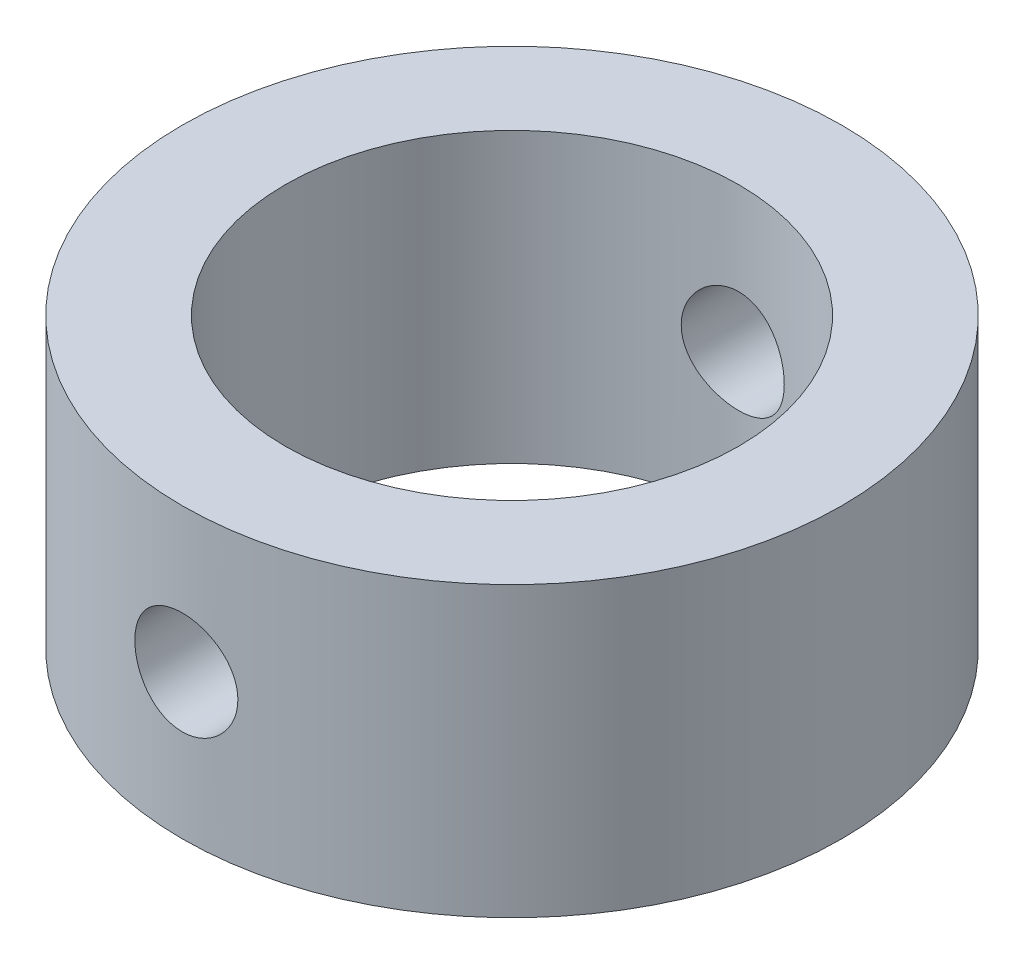
ISO-10303-21;
HEADER;
FILE_DESCRIPTION(('STEP AP214'),'2;1');
FILE_NAME('part.step','',(''),(''),'','','');
FILE_SCHEMA(('AUTOMOTIVE_DESIGN { 1 0 10303 214 1 1 1 1 }'));
ENDSEC;
DATA;
#1=APPLICATION_CONTEXT('core data for automotive mechanical design processes');
#2=APPLICATION_PROTOCOL_DEFINITION('international standard','automotive_design',2000,#1);
#3=PRODUCT_CONTEXT('',#1,'mechanical');
#4=PRODUCT('Part','Part','',(#3));
#5=PRODUCT_RELATED_PRODUCT_CATEGORY('part','',(#4));
#6=PRODUCT_DEFINITION_FORMATION('','',#4);
#7=PRODUCT_DEFINITION_CONTEXT('part definition',#1,'design');
#8=PRODUCT_DEFINITION('design','',#6,#7);
#9=PRODUCT_DEFINITION_SHAPE('','',#8);
#10=(LENGTH_UNIT() NAMED_UNIT(*) SI_UNIT(.MILLI.,.METRE.));
#11=(NAMED_UNIT(*) PLANE_ANGLE_UNIT() SI_UNIT($,.RADIAN.));
#12=(NAMED_UNIT(*) SI_UNIT($,.STERADIAN.) SOLID_ANGLE_UNIT());
#13=UNCERTAINTY_MEASURE_WITH_UNIT(LENGTH_MEASURE(1.E-05),#10,'distance_accuracy_value','');
#14=(GEOMETRIC_REPRESENTATION_CONTEXT(3) GLOBAL_UNCERTAINTY_ASSIGNED_CONTEXT((#13)) GLOBAL_UNIT_ASSIGNED_CONTEXT((#10,
#11,#12)) REPRESENTATION_CONTEXT('',''));
#15=CARTESIAN_POINT('',(0.,0.,0.));
#16=DIRECTION('',(0.,0.,1.));
#17=DIRECTION('',(1.,0.,0.));
#18=AXIS2_PLACEMENT_3D('',#15,#16,#17);
#19=CARTESIAN_POINT('',(0.,0.,0.));
#20=DIRECTION('',(0.,-1.,0.));
#21=DIRECTION('',(0.,0.,-1.));
#22=AXIS2_PLACEMENT_3D('',#19,#20,#21);
#23=CYLINDRICAL_SURFACE('',#22,16.);
#24=CARTESIAN_POINT('',(0.,9.5,-16.));
#25=CARTESIAN_POINT('',(-0.139515097271033,9.49999430172848,-15.9999977019448));
#26=CARTESIAN_POINT('',(-0.279109404865704,9.48828188622644,-15.9981561248574));
#27=CARTESIAN_POINT('',(-0.554391314978102,9.44175630872325,-15.9909869809759));
#28=CARTESIAN_POINT('',(-0.690075061323317,9.40692110749649,-15.9856560884472));
#29=CARTESIAN_POINT('',(-0.953512538047404,9.31522033719338,-15.9721069716578));
#30=CARTESIAN_POINT('',(-1.0812723522899,9.2583719186384,-15.9638909956317));
#31=CARTESIAN_POINT('',(-1.3254212510446,9.12430145485839,-15.9454779403815));
#32=CARTESIAN_POINT('',(-1.44181181036831,9.04708205696406,-15.9352811186255));
#33=CARTESIAN_POINT('',(-1.66091991165162,8.87376695164604,-15.9139426841436));
#34=CARTESIAN_POINT('',(-1.76352747914264,8.77753300510975,-15.9027945139234));
#35=CARTESIAN_POINT('',(-1.95120768822823,8.56921805173111,-15.8808607613029));
#36=CARTESIAN_POINT('',(-2.03627928654192,8.4571361026998,-15.8700752005075));
#37=CARTESIAN_POINT('',(-2.18690544328884,8.21956172865627,-15.8500242812745));
#38=CARTESIAN_POINT('',(-2.25235273557992,8.09400051763821,-15.840767397861));
#39=CARTESIAN_POINT('',(-2.36118681597065,7.8334985891422,-15.8249120174236));
#40=CARTESIAN_POINT('',(-2.40457491010063,7.69855842748944,-15.8183133630222));
#41=CARTESIAN_POINT('',(-2.46771559322167,7.42428909885621,-15.8085863451104));
#42=CARTESIAN_POINT('',(-2.48765705487496,7.2850044141812,-15.8054302653236));
#43=CARTESIAN_POINT('',(-2.50392369757622,7.00503281110736,-15.8028617107177));
#44=CARTESIAN_POINT('',(-2.50025034860466,6.86434598053396,-15.8034490028802));
#45=CARTESIAN_POINT('',(-2.4695458080889,6.58690296814731,-15.8082755045521));
#46=CARTESIAN_POINT('',(-2.44272562959693,6.45012277664685,-15.8124817218495));
#47=CARTESIAN_POINT('',(-2.36681937833752,6.18302799364068,-15.8240205634547));
#48=CARTESIAN_POINT('',(-2.31773262684132,6.05271359935946,-15.8313532830641));
#49=CARTESIAN_POINT('',(-2.19846916949384,5.80161128732284,-15.8483550685462));
#50=CARTESIAN_POINT('',(-2.12820372315549,5.68086620822693,-15.8580339308724));
#51=CARTESIAN_POINT('',(-1.96864058146637,5.45280046431446,-15.878630461501));
#52=CARTESIAN_POINT('',(-1.87934153253017,5.34548075511253,-15.8895482178821));
#53=CARTESIAN_POINT('',(-1.68309088822333,5.14608975336669,-15.911537862489));
#54=CARTESIAN_POINT('',(-1.57595800560539,5.05419684173054,-15.9226101363559));
#55=CARTESIAN_POINT('',(-1.34769694737936,4.8896668543601,-15.9435512534783));
#56=CARTESIAN_POINT('',(-1.22656870068132,4.81702987644317,-15.9534200906202));
#57=CARTESIAN_POINT('',(-0.973595927056492,4.69306192657761,-15.9708539902704));
#58=CARTESIAN_POINT('',(-0.841744186240461,4.641745441467,-15.9784174854193));
#59=CARTESIAN_POINT('',(-0.57114953469676,4.56203403255277,-15.9903756000068));
#60=CARTESIAN_POINT('',(-0.432407130687201,4.53363742593352,-15.9947704520898));
#61=CARTESIAN_POINT('',(-0.153508336763735,4.50081072354981,-15.9998651172728));
#62=CARTESIAN_POINT('',(-0.0133814615087023,4.49613552102382,-16.0006027179286));
#63=CARTESIAN_POINT('',(0.265654546411642,4.51023270533598,-15.9984028649127));
#64=CARTESIAN_POINT('',(0.404563719925156,4.52900430258911,-15.9954655349964));
#65=CARTESIAN_POINT('',(0.676473446265705,4.58925838768018,-15.9862692369322));
#66=CARTESIAN_POINT('',(0.809501262056042,4.63062075826773,-15.9800278421539));
#67=CARTESIAN_POINT('',(1.06673406785663,4.73475509439879,-15.9649207568356));
#68=CARTESIAN_POINT('',(1.19093861303941,4.79752813844267,-15.9560549341007));
#69=CARTESIAN_POINT('',(1.42807220225041,4.94327199112658,-15.9365897274094));
#70=CARTESIAN_POINT('',(1.54090512378373,5.02639742009048,-15.9259772866342));
#71=CARTESIAN_POINT('',(1.75110696507806,5.21027208590779,-15.9042388046444));
#72=CARTESIAN_POINT('',(1.84847490447018,5.31102243920485,-15.8931127309268));
#73=CARTESIAN_POINT('',(2.02588080776691,5.52838119721721,-15.8714802753665));
#74=CARTESIAN_POINT('',(2.10575398584126,5.64512484712233,-15.860980411908));
#75=CARTESIAN_POINT('',(2.2447556772664,5.89051607366133,-15.8419069280583));
#76=CARTESIAN_POINT('',(2.30388478778105,6.01916330748948,-15.83333325222));
#77=CARTESIAN_POINT('',(2.39946771944995,6.28422964071419,-15.8191307135236));
#78=CARTESIAN_POINT('',(2.43600654947912,6.42061746876562,-15.8134908234896));
#79=CARTESIAN_POINT('',(2.48564122040535,6.69768914366398,-15.8057657028079));
#80=CARTESIAN_POINT('',(2.49873883084997,6.83837266541901,-15.8036802038444));
#81=CARTESIAN_POINT('',(2.50107452690756,7.11839871590748,-15.8033105804488));
#82=CARTESIAN_POINT('',(2.49057180548425,7.2577390969335,-15.804985160429));
#83=CARTESIAN_POINT('',(2.44656223255901,7.53264529714429,-15.8118569894183));
#84=CARTESIAN_POINT('',(2.41305543086961,7.66821112450172,-15.8170542307995));
#85=CARTESIAN_POINT('',(2.32408329891852,7.93163782664052,-15.8303708885491));
#86=CARTESIAN_POINT('',(2.26863761738581,8.05950547825841,-15.8384876895341));
#87=CARTESIAN_POINT('',(2.13738768546417,8.30416561367627,-15.856731840474));
#88=CARTESIAN_POINT('',(2.06158262820886,8.42095765828843,-15.8668592701083));
#89=CARTESIAN_POINT('',(1.8908300813908,8.64146554412683,-15.8881156809226));
#90=CARTESIAN_POINT('',(1.79569107094768,8.74503219661384,-15.8992540116029));
#91=CARTESIAN_POINT('',(1.58937594638204,8.93482123638674,-15.9212004364073));
#92=CARTESIAN_POINT('',(1.47819612078432,9.02103959859188,-15.9320084534012));
#93=CARTESIAN_POINT('',(1.24216685884341,9.17415122303156,-15.952151024567));
#94=CARTESIAN_POINT('',(1.11723937214238,9.24092537275962,-15.9614763443027));
#95=CARTESIAN_POINT('',(0.857851882357783,9.35244099619295,-15.9775125983888));
#96=CARTESIAN_POINT('',(0.723401776581761,9.39720497255839,-15.9842262014212));
#97=CARTESIAN_POINT('',(0.490314239911593,9.45343302109059,-15.9927744586488));
#98=CARTESIAN_POINT('',(0.393105575651624,9.470868490629,-15.9954699162612));
#99=CARTESIAN_POINT('',(0.197277797850582,9.49415391337908,-15.9990834869762));
#100=CARTESIAN_POINT('',(0.0986587041691186,9.50000402955734,-16.0000016250796));
#101=CARTESIAN_POINT('',(0.,9.5,-16.));
#102=B_SPLINE_CURVE_WITH_KNOTS('',3,(#24,#25,#26,#27,#28,#29,#30,#31,#32,#33,#34,#35,#36,#37,
#38,#39,#40,#41,#42,#43,#44,#45,#46,#47,#48,#49,#50,#51,#52,#53,#54,#55,#56,#57,#58,#59,#60,#61,
#62,#63,#64,#65,#66,#67,#68,#69,#70,#71,#72,#73,#74,#75,#76,#77,#78,#79,#80,#81,#82,#83,#84,#85,
#86,#87,#88,#89,#90,#91,#92,#93,#94,#95,#96,#97,#98,#99,#100,#101),.UNSPECIFIED.,.T.,.F.,(4,2,2,
2,2,2,2,2,2,2,2,2,2,2,2,2,2,2,2,2,2,2,2,2,2,2,2,2,2,2,2,2,2,2,2,2,2,2,4),(0.,0.418184740477491,
0.836768642528014,1.25502707944103,1.6732311879203,2.09459568152199,2.51598523645422,
2.93963778605759,3.36326525009239,3.78345631134995,4.20362121670545,4.6199957602258,
5.03638299651051,5.45453977402347,5.87272629892068,6.29545732334367,6.71819049513827,
7.14121043754565,7.56419931829866,7.98280854005914,8.40140366528356,8.81779444756567,
9.23420620742031,9.65388541469671,10.0735912160142,10.4970948024959,10.9205861964898,
11.3424741039513,11.764330162293,12.1815758159869,12.598820566189,13.0156924696662,
13.4325808967135,13.8538201231554,14.275156971423,14.6990230419984,15.1224548565628,
15.4181801635154,15.7139013105871),.UNSPECIFIED.);
#103=CARTESIAN_POINT('',(0.,9.5,-16.));
#104=VERTEX_POINT('',#103);
#105=EDGE_CURVE('E94',#104,#104,#102,.T.);
#106=ORIENTED_EDGE('',*,*,#105,.T.);
#107=EDGE_LOOP('',(#106));
#108=FACE_BOUND('',#107,.T.);
#109=CARTESIAN_POINT('',(2.5,7.,15.8034806292791));
#110=CARTESIAN_POINT('',(2.49999429179104,6.86049662165902,15.8034830346332));
#111=CARTESIAN_POINT('',(2.48828377742084,6.72091400231469,15.8053478026579));
#112=CARTESIAN_POINT('',(2.44176643645043,6.44565637099715,15.8125997089632));
#113=CARTESIAN_POINT('',(2.40693752801736,6.30998522452064,15.8179902148259));
#114=CARTESIAN_POINT('',(2.31525516047132,6.04657441035561,15.8316684916183));
#115=CARTESIAN_POINT('',(2.25841914921921,5.91882855212924,15.8399539668268));
#116=CARTESIAN_POINT('',(2.12437791816389,5.67470310915788,15.8584858981599));
#117=CARTESIAN_POINT('',(2.04717531605122,5.55832206634046,15.8687321022281));
#118=CARTESIAN_POINT('',(1.8738773011091,5.33920351484873,15.8901303851737));
#119=CARTESIAN_POINT('',(1.77763988617499,5.23657892560036,15.9012888784461));
#120=CARTESIAN_POINT('',(1.56931080987672,5.04886577957007,15.9231973082665));
#121=CARTESIAN_POINT('',(1.45721825316848,4.96377821377571,15.9339472216983));
#122=CARTESIAN_POINT('',(1.21963429185761,4.81313512295885,15.9538946715316));
#123=CARTESIAN_POINT('',(1.09407592635729,4.74768399602554,15.9630838016344));
#124=CARTESIAN_POINT('',(0.833580171794755,4.63884204527492,15.978803149105));
#125=CARTESIAN_POINT('',(0.69864332013681,4.59544995861733,15.9853335186778));
#126=CARTESIAN_POINT('',(0.42438532544881,4.53230128104384,15.9949542857973));
#127=CARTESIAN_POINT('',(0.285108760160751,4.51235535093165,15.9980722260505));
#128=CARTESIAN_POINT('',(0.00515314355066968,4.49607695669663,16.0006113098095));
#129=CARTESIAN_POINT('',(-0.135525822989188,4.49974307364815,16.0000326754547));
#130=CARTESIAN_POINT('',(-0.413000089722152,4.53043592627786,15.9952657389868));
#131=CARTESIAN_POINT('',(-0.549818542575175,4.55725893884032,15.9911089169598));
#132=CARTESIAN_POINT('',(-0.816988375343493,4.63318402862262,15.9796877395528));
#133=CARTESIAN_POINT('',(-0.947339577352176,4.68228671835414,15.9724232987387));
#134=CARTESIAN_POINT('',(-1.19848742679247,4.80158365586005,15.9555491842028));
#135=CARTESIAN_POINT('',(-1.31924299071837,4.87186300542795,15.9459300777042));
#136=CARTESIAN_POINT('',(-1.54732385653213,5.03145608062924,15.9254174702046));
#137=CARTESIAN_POINT('',(-1.65464819959324,5.12077116395499,15.9145238783282));
#138=CARTESIAN_POINT('',(-1.85402198520023,5.31703348707326,15.8925387825556));
#139=CARTESIAN_POINT('',(-1.94589625613075,5.42415866639486,15.8814464071021));
#140=CARTESIAN_POINT('',(-2.11039226047485,5.65239756468213,15.8604269384475));
#141=CARTESIAN_POINT('',(-2.18301385538335,5.77351138427406,15.8504998536298));
#142=CARTESIAN_POINT('',(-2.30697060635685,6.0264796281058,15.8329349281613));
#143=CARTESIAN_POINT('',(-2.35828663884161,6.15834357507345,15.8252991458489));
#144=CARTESIAN_POINT('',(-2.43799343127668,6.42896484870548,15.8132168990948));
#145=CARTESIAN_POINT('',(-2.46638595195258,6.56772164506972,15.8087701897074));
#146=CARTESIAN_POINT('',(-2.49919719237856,6.84662810327521,15.8036163696886));
#147=CARTESIAN_POINT('',(-2.50386473411271,6.98674780019476,15.80287044806));
#148=CARTESIAN_POINT('',(-2.48975479033184,7.26576763529791,15.8050994977182));
#149=CARTESIAN_POINT('',(-2.47097809654328,7.40466781450586,15.8080743433524));
#150=CARTESIAN_POINT('',(-2.41072412555896,7.67652780746647,15.8173740105186));
#151=CARTESIAN_POINT('',(-2.36937178781979,7.8095159986396,15.8236803883335));
#152=CARTESIAN_POINT('',(-2.26527072241932,8.06667397110389,15.8389172439685));
#153=CARTESIAN_POINT('',(-2.20252085602949,8.19084328264902,15.8478478614411));
#154=CARTESIAN_POINT('',(-2.05681199170293,8.42795128164882,15.8674179220711));
#155=CARTESIAN_POINT('',(-1.97369251093471,8.54079022889997,15.8780706945976));
#156=CARTESIAN_POINT('',(-1.78982593995283,8.75100698084821,15.8998450469621));
#157=CARTESIAN_POINT('',(-1.6890777652142,8.84838383360704,15.9109666556111));
#158=CARTESIAN_POINT('',(-1.47171546765808,9.02581127063547,15.9325473887455));
#159=CARTESIAN_POINT('',(-1.35496564158984,9.10569657643007,15.9429995842164));
#160=CARTESIAN_POINT('',(-1.10955861029337,9.24471951999024,15.9619548934084));
#161=CARTESIAN_POINT('',(-0.98090175316249,9.30385776404594,15.9704580640831));
#162=CARTESIAN_POINT('',(-0.715839663778324,9.39944627528415,15.9845269767683));
#163=CARTESIAN_POINT('',(-0.579467147617086,9.43598549743941,15.9901042225572));
#164=CARTESIAN_POINT('',(-0.302427949770743,9.48562613267281,15.9977412978946));
#165=CARTESIAN_POINT('',(-0.161761577654429,9.49872923135596,15.9998013804089));
#166=CARTESIAN_POINT('',(0.118272165188272,9.50108185265522,16.0001691012796));
#167=CARTESIAN_POINT('',(0.257637428859788,9.49058374464277,15.9985164403994));
#168=CARTESIAN_POINT('',(0.532594595464884,9.44657468381965,15.9917247801431));
#169=CARTESIAN_POINT('',(0.668186513581643,9.41306382362158,15.9865857947973));
#170=CARTESIAN_POINT('',(0.931668850429403,9.32407274028764,15.9733964142131));
#171=CARTESIAN_POINT('',(1.05956579651625,9.26861144841907,15.965348528289));
#172=CARTESIAN_POINT('',(1.30427807253219,9.13732116147798,15.947223323121));
#173=CARTESIAN_POINT('',(1.42109298145458,9.06149139302579,15.9371459268214));
#174=CARTESIAN_POINT('',(1.64160219185804,8.89071055679162,15.9159528222148));
#175=CARTESIAN_POINT('',(1.745151694824,8.79557368569597,15.9048276353277));
#176=CARTESIAN_POINT('',(1.93490712736948,8.5892700426646,15.8828612878644));
#177=CARTESIAN_POINT('',(2.02110898563013,8.4780995182753,15.8720201944801));
#178=CARTESIAN_POINT('',(2.17420151541622,8.24207889572462,15.8517779742959));
#179=CARTESIAN_POINT('',(2.24097044145096,8.1171490413903,15.842386091806));
#180=CARTESIAN_POINT('',(2.35247565604314,7.85775678236998,15.8262143333515));
#181=CARTESIAN_POINT('',(2.3972345005847,7.72330429888342,15.8194317848938));
#182=CARTESIAN_POINT('',(2.45344906957713,7.4902302603036,15.8107909670081));
#183=CARTESIAN_POINT('',(2.47087849275467,7.39303840001512,15.8080643798014));
#184=CARTESIAN_POINT('',(2.49415589078729,7.19724421895363,15.804408373768));
#185=CARTESIAN_POINT('',(2.50000403623692,7.09864191897824,15.8034789284691));
#186=CARTESIAN_POINT('',(2.5,7.,15.8034806292791));
#187=B_SPLINE_CURVE_WITH_KNOTS('',3,(#109,#110,#111,#112,#113,#114,#115,#116,#117,#118,#119,
#120,#121,#122,#123,#124,#125,#126,#127,#128,#129,#130,#131,#132,#133,#134,#135,#136,#137,#138,
#139,#140,#141,#142,#143,#144,#145,#146,#147,#148,#149,#150,#151,#152,#153,#154,#155,#156,#157,
#158,#159,#160,#161,#162,#163,#164,#165,#166,#167,#168,#169,#170,#171,#172,#173,#174,#175,#176,
#177,#178,#179,#180,#181,#182,#183,#184,#185,#186),.UNSPECIFIED.,.T.,.F.,(4,2,2,2,2,2,2,2,2,2,2,
2,2,2,2,2,2,2,2,2,2,2,2,2,2,2,2,2,2,2,2,2,2,2,2,2,2,2,4),(0.,0.41814952790224,0.836699032574078,
1.25491737645053,1.67308199345223,2.09449258051085,2.51592697424482,2.93956378022295,
3.36317633102574,3.78334397517517,4.20348637030326,4.61996979150786,5.03646466334576,
5.45465612930833,5.87287743207563,6.29556043395287,6.71824647655855,7.14131110038651,
7.56434322607052,7.98292940034458,8.40150143908464,8.81778013452042,9.23408098683358,
9.65377352836981,10.0734918986585,10.4970197199928,10.9205351635679,11.3423727623224,
11.7641800198745,12.18149834073,12.5988149821383,13.0157724881518,13.432745828047,
13.8539404040181,14.275233715164,14.6991122166338,15.1225554163993,15.4182305458031,
15.7139013198205),.UNSPECIFIED.);
#188=CARTESIAN_POINT('',(2.5,7.,15.8034806292791));
#189=VERTEX_POINT('',#188);
#190=EDGE_CURVE('E88',#189,#189,#187,.T.);
#191=ORIENTED_EDGE('',*,*,#190,.T.);
#192=EDGE_LOOP('',(#191));
#193=FACE_BOUND('',#192,.T.);
#194=CARTESIAN_POINT('',(0.,0.,0.));
#195=DIRECTION('',(0.,-1.,0.));
#196=DIRECTION('',(0.,0.,-1.));
#197=AXIS2_PLACEMENT_3D('',#194,#195,#196);
#198=CIRCLE('',#197,16.);
#199=CARTESIAN_POINT('',(0.,0.,-16.));
#200=VERTEX_POINT('',#199);
#201=EDGE_CURVE('E10',#200,#200,#198,.T.);
#202=ORIENTED_EDGE('',*,*,#201,.F.);
#203=EDGE_LOOP('',(#202));
#204=FACE_BOUND('',#203,.T.);
#205=CARTESIAN_POINT('',(0.,14.,0.));
#206=DIRECTION('',(0.,-1.,0.));
#207=DIRECTION('',(0.,0.,-1.));
#208=AXIS2_PLACEMENT_3D('',#205,#206,#207);
#209=CIRCLE('',#208,16.);
#210=CARTESIAN_POINT('',(0.,14.,-16.));
#211=VERTEX_POINT('',#210);
#212=EDGE_CURVE('E101',#211,#211,#209,.T.);
#213=ORIENTED_EDGE('',*,*,#212,.T.);
#214=EDGE_LOOP('',(#213));
#215=FACE_BOUND('',#214,.T.);
#216=ADVANCED_FACE('F45',(#108,#193,#204,#215),#23,.T.);
#217=CARTESIAN_POINT('',(-16.,0.,0.));
#218=DIRECTION('',(0.,1.,0.));
#219=DIRECTION('',(0.,0.,1.));
#220=AXIS2_PLACEMENT_3D('',#217,#218,#219);
#221=PLANE('',#220);
#222=CARTESIAN_POINT('',(0.,0.,0.));
#223=DIRECTION('',(0.,-1.,0.));
#224=DIRECTION('',(0.,0.,-1.));
#225=AXIS2_PLACEMENT_3D('',#222,#223,#224);
#226=CIRCLE('',#225,11.);
#227=CARTESIAN_POINT('',(0.,0.,-11.));
#228=VERTEX_POINT('',#227);
#229=EDGE_CURVE('E59',#228,#228,#226,.T.);
#230=ORIENTED_EDGE('',*,*,#229,.F.);
#231=EDGE_LOOP('',(#230));
#232=FACE_BOUND('',#231,.T.);
#233=ORIENTED_EDGE('',*,*,#201,.T.);
#234=EDGE_LOOP('',(#233));
#235=FACE_BOUND('',#234,.T.);
#236=ADVANCED_FACE('F111',(#232,#235),#221,.F.);
#237=CARTESIAN_POINT('',(0.,0.,0.));
#238=DIRECTION('',(0.,-1.,0.));
#239=DIRECTION('',(0.,0.,-1.));
#240=AXIS2_PLACEMENT_3D('',#237,#238,#239);
#241=CYLINDRICAL_SURFACE('',#240,11.);
#242=CARTESIAN_POINT('',(0.,9.5,-11.));
#243=CARTESIAN_POINT('',(0.138518278596904,9.49999546817359,-10.9999974735185));
#244=CARTESIAN_POINT('',(0.277090172258008,9.48844877242309,-10.9973570934613));
#245=CARTESIAN_POINT('',(0.550288594599323,9.44262052393831,-10.987079320306));
#246=CARTESIAN_POINT('',(0.68491239222073,9.40832360404474,-10.9794385496265));
#247=CARTESIAN_POINT('',(0.946227671984916,9.31813195136811,-10.9600095312294));
#248=CARTESIAN_POINT('',(1.07292759495647,9.26226067201927,-10.9482257885674));
#249=CARTESIAN_POINT('',(1.31515227582566,9.13058288661913,-10.921778201627));
#250=CARTESIAN_POINT('',(1.43067714503182,9.05477657915759,-10.9071143860398));
#251=CARTESIAN_POINT('',(1.64926760444638,8.88399795539333,-10.8762265816814));
#252=CARTESIAN_POINT('',(1.75211293892049,8.78874742652499,-10.8599819758326));
#253=CARTESIAN_POINT('',(1.9405138981661,8.58238102586276,-10.827906511833));
#254=CARTESIAN_POINT('',(2.02606788121784,8.47126364930555,-10.8120756930933));
#255=CARTESIAN_POINT('',(2.17844599401787,8.23466794471632,-10.7824158369221));
#256=CARTESIAN_POINT('',(2.24503254356575,8.10903300369417,-10.7686131580577));
#257=CARTESIAN_POINT('',(2.3560606971787,7.84799049941838,-10.7448696147509));
#258=CARTESIAN_POINT('',(2.40050517717749,7.71258420793838,-10.7349282488168));
#259=CARTESIAN_POINT('',(2.46525349412718,7.43824081288346,-10.7202434469831));
#260=CARTESIAN_POINT('',(2.48594892680754,7.29940073687745,-10.715415797339));
#261=CARTESIAN_POINT('',(2.50382988451487,7.02014177278689,-10.7112523406768));
#262=CARTESIAN_POINT('',(2.50101853886552,6.87972309733773,-10.711915802658));
#263=CARTESIAN_POINT('',(2.47228016958762,6.6042271166513,-10.7185835035919));
#264=CARTESIAN_POINT('',(2.44681104599438,6.46909909380509,-10.7244819412976));
#265=CARTESIAN_POINT('',(2.37420684920502,6.20508551384518,-10.7407873672743));
#266=CARTESIAN_POINT('',(2.32707047404288,6.07620033237282,-10.7511946264744));
#267=CARTESIAN_POINT('',(2.21205734402544,5.82705932818947,-10.7754474384537));
#268=CARTESIAN_POINT('',(2.14400712086008,5.70688648223631,-10.7893215597825));
#269=CARTESIAN_POINT('',(1.98921977920408,5.47949744688893,-10.8189276843241));
#270=CARTESIAN_POINT('',(1.90247992237134,5.37228315973606,-10.8346599596346));
#271=CARTESIAN_POINT('',(1.71036518003517,5.17122143817898,-10.8666615287251));
#272=CARTESIAN_POINT('',(1.60460166742828,5.07774557348364,-10.882934773515));
#273=CARTESIAN_POINT('',(1.37871229840972,4.90979411129289,-10.9138502597158));
#274=CARTESIAN_POINT('',(1.2585861400908,4.83531891330053,-10.9284924668293));
#275=CARTESIAN_POINT('',(1.00690799179916,4.7073796120285,-10.9545497424637));
#276=CARTESIAN_POINT('',(0.87532883434816,4.65396722637767,-10.9659568484873));
#277=CARTESIAN_POINT('',(0.604745122491699,4.57011599413207,-10.9841998956698));
#278=CARTESIAN_POINT('',(0.465741739663721,4.53967353417782,-10.9910365557784));
#279=CARTESIAN_POINT('',(0.187439840192734,4.50317376252731,-10.9992650071756));
#280=CARTESIAN_POINT('',(0.0482110923370397,4.49660930868326,-11.0007700184113));
#281=CARTESIAN_POINT('',(-0.229353886680102,4.50667303985293,-10.9984842255063));
#282=CARTESIAN_POINT('',(-0.367690182720857,4.52329951940597,-10.9946938107912));
#283=CARTESIAN_POINT('',(-0.637841677218458,4.57885316690542,-10.9823148103741));
#284=CARTESIAN_POINT('',(-0.769715036814425,4.61751154644373,-10.973784087055));
#285=CARTESIAN_POINT('',(-1.0251039308776,4.71573102745707,-10.9528806132367));
#286=CARTESIAN_POINT('',(-1.14861871432289,4.77529400425326,-10.9405075180554));
#287=CARTESIAN_POINT('',(-1.38586085256056,4.91466914355534,-10.9130143275095));
#288=CARTESIAN_POINT('',(-1.49941068522719,4.99477562677316,-10.8978552985532));
#289=CARTESIAN_POINT('',(-1.71163773579052,5.1725793284402,-10.866546095646));
#290=CARTESIAN_POINT('',(-1.8103128535797,5.27027902654684,-10.8503957821912));
#291=CARTESIAN_POINT('',(-1.99201706218096,5.48283096513342,-10.8185287714487));
#292=CARTESIAN_POINT('',(-2.07469366594062,5.59798724178681,-10.8028272119253));
#293=CARTESIAN_POINT('',(-2.21953814406553,5.84084639067027,-10.7740023321604));
#294=CARTESIAN_POINT('',(-2.28170692501017,5.96854870795962,-10.7608788979592));
#295=CARTESIAN_POINT('',(-2.38333597241928,6.23218046956891,-10.7388274870674));
#296=CARTESIAN_POINT('',(-2.42292716221705,6.36805732374335,-10.7298753781702));
#297=CARTESIAN_POINT('',(-2.47865258340365,6.64476690669912,-10.7171411058581));
#298=CARTESIAN_POINT('',(-2.49479091341614,6.78559876513639,-10.7133580391079));
#299=CARTESIAN_POINT('',(-2.50296739214165,7.06465861931089,-10.7114502943222));
#300=CARTESIAN_POINT('',(-2.49556548501071,7.2028695993336,-10.7131941458177));
#301=CARTESIAN_POINT('',(-2.45813115403283,7.47601891018826,-10.7218446846914));
#302=CARTESIAN_POINT('',(-2.42809904217009,7.61095728611047,-10.7287513008948));
#303=CARTESIAN_POINT('',(-2.34653692360609,7.87324339736628,-10.7468826027048));
#304=CARTESIAN_POINT('',(-2.29509457527995,8.0006196911415,-10.758089666867));
#305=CARTESIAN_POINT('',(-2.1722453660688,8.24501470690061,-10.783564723281));
#306=CARTESIAN_POINT('',(-2.10083623731223,8.36203225032551,-10.7978330631966));
#307=CARTESIAN_POINT('',(-1.93824996891049,8.58513442765527,-10.828211072634));
#308=CARTESIAN_POINT('',(-1.84667645642834,8.69092572220738,-10.8443540558786));
#309=CARTESIAN_POINT('',(-1.64715628932417,8.88582318508195,-10.8764454859305));
#310=CARTESIAN_POINT('',(-1.53920583540676,8.97492547096597,-10.8923938866665));
#311=CARTESIAN_POINT('',(-1.30814060515056,9.13513806023371,-10.9225693389041));
#312=CARTESIAN_POINT('',(-1.1848316218762,9.20597382333314,-10.9367686161711));
#313=CARTESIAN_POINT('',(-0.927755967711688,9.32579997066296,-10.9615640551399));
#314=CARTESIAN_POINT('',(-0.793997844337694,9.37480799478667,-10.9721631246672));
#315=CARTESIAN_POINT('',(-0.550163071539621,9.44122790617612,-10.9867559512784));
#316=CARTESIAN_POINT('',(-0.441368111138488,9.4632239876893,-10.9916908558499));
#317=CARTESIAN_POINT('',(-0.221726814930916,9.49261147357934,-10.9983138080738));
#318=CARTESIAN_POINT('',(-0.1108805847171,9.50000362761917,-11.0000020223883));
#319=CARTESIAN_POINT('',(0.,9.5,-11.));
#320=B_SPLINE_CURVE_WITH_KNOTS('',3,(#242,#243,#244,#245,#246,#247,#248,#249,#250,#251,#252,
#253,#254,#255,#256,#257,#258,#259,#260,#261,#262,#263,#264,#265,#266,#267,#268,#269,#270,#271,
#272,#273,#274,#275,#276,#277,#278,#279,#280,#281,#282,#283,#284,#285,#286,#287,#288,#289,#290,
#291,#292,#293,#294,#295,#296,#297,#298,#299,#300,#301,#302,#303,#304,#305,#306,#307,#308,#309,
#310,#311,#312,#313,#314,#315,#316,#317,#318,#319),.UNSPECIFIED.,.T.,.F.,(4,2,2,2,2,2,2,2,2,2,2,
2,2,2,2,2,2,2,2,2,2,2,2,2,2,2,2,2,2,2,2,2,2,2,2,2,2,2,4),(0.,0.415148849633315,
0.830578406996929,1.24555761755319,1.66053269430525,2.08192389396809,2.50335508365802,
2.92985362973414,3.35629676538239,3.77560244898082,4.19485231368757,4.60581714174235,
5.01680666753971,5.4313015743885,5.84585725297978,6.27011531803704,6.69438230269862,
7.11968464096647,7.54492006169895,7.96106941916761,8.37718817463627,8.78833576149036,
9.19952024123083,9.61696129328767,10.0344612272567,10.460313215404,10.8861463755948,
11.3094844190899,11.732748471094,12.1460204395145,12.5592867105954,12.9708773657615,
13.382514789318,13.8031102578591,14.2238034502007,14.6504927745347,15.0768366452215,
15.4091704772436,15.74148724914),.UNSPECIFIED.);
#321=CARTESIAN_POINT('',(0.,9.5,-11.));
#322=VERTEX_POINT('',#321);
#323=EDGE_CURVE('E49',#322,#322,#320,.T.);
#324=ORIENTED_EDGE('',*,*,#323,.T.);
#325=EDGE_LOOP('',(#324));
#326=FACE_BOUND('',#325,.T.);
#327=CARTESIAN_POINT('',(2.5,7.,10.7121426428143));
#328=CARTESIAN_POINT('',(2.49999543238962,7.13846619095453,10.7121454314233));
#329=CARTESIAN_POINT('',(2.48845712333954,7.27698608233719,10.7148566472694));
#330=CARTESIAN_POINT('',(2.44266520236751,7.55007657505633,10.7253866484904));
#331=CARTESIAN_POINT('',(2.40839601066357,7.68464440153449,10.7332089369474));
#332=CARTESIAN_POINT('',(2.31828540377217,7.94584105837347,10.7530304465066));
#333=CARTESIAN_POINT('',(2.26246873972878,8.07247880458495,10.7650248735991));
#334=CARTESIAN_POINT('',(2.13091974990438,8.31459839968131,10.7918333757398));
#335=CARTESIAN_POINT('',(2.05518750087741,8.43008029155815,10.8066474399211));
#336=CARTESIAN_POINT('',(1.88448528035886,8.64871548087091,10.8377278041731));
#337=CARTESIAN_POINT('',(1.78922044020224,8.75163578041055,10.8540139214629));
#338=CARTESIAN_POINT('',(1.58279346057436,8.94018250510919,10.8860302886159));
#339=CARTESIAN_POINT('',(1.4716300245101,9.02580751839435,10.9017604930117));
#340=CARTESIAN_POINT('',(1.23499021284435,9.17826304827206,10.93110941005));
#341=CARTESIAN_POINT('',(1.10936512825883,9.24486820043069,10.9447020098483));
#342=CARTESIAN_POINT('',(0.848343855636442,9.35593341841309,10.9680197641523));
#343=CARTESIAN_POINT('',(0.712948855424523,9.40039617113036,10.9777453878714));
#344=CARTESIAN_POINT('',(0.438655593897397,9.4651780957488,10.992093320832));
#345=CARTESIAN_POINT('',(0.299854987503796,9.48589197735749,10.9967989680676));
#346=CARTESIAN_POINT('',(0.0206744590410413,9.5038235330812,11.0008659279287));
#347=CARTESIAN_POINT('',(-0.119705266442306,9.50104410026593,11.0002278985982));
#348=CARTESIAN_POINT('',(-0.395333870912045,9.47235927142653,10.9937426547597));
#349=CARTESIAN_POINT('',(-0.530629631624531,9.44687947198624,10.9879913110538));
#350=CARTESIAN_POINT('',(-0.794973031158362,9.37419692034857,10.972035500945));
#351=CARTESIAN_POINT('',(-0.92402037284203,9.32699313620665,10.9618308229987));
#352=CARTESIAN_POINT('',(-1.17336944375684,9.21183459013289,10.9379627182996));
#353=CARTESIAN_POINT('',(-1.29359524399307,9.14372109926424,10.9242729764965));
#354=CARTESIAN_POINT('',(-1.52106399956616,8.9887954880441,10.8949317146097));
#355=CARTESIAN_POINT('',(-1.62830505215689,8.90198063241803,10.8792799076932));
#356=CARTESIAN_POINT('',(-1.82929354427355,8.7098085843367,10.8473171066438));
#357=CARTESIAN_POINT('',(-1.92268414978479,8.60407898919961,10.8309992019581));
#358=CARTESIAN_POINT('',(-2.09047920073133,8.37828918426258,10.7998704044976));
#359=CARTESIAN_POINT('',(-2.16488304500243,8.25822852088493,10.7850595594488));
#360=CARTESIAN_POINT('',(-2.29276887377835,8.00657601189026,10.7586016791364));
#361=CARTESIAN_POINT('',(-2.3461786596901,7.87494624608021,10.7469656031437));
#362=CARTESIAN_POINT('',(-2.43000958929392,7.60425144626069,10.7283231226734));
#363=CARTESIAN_POINT('',(-2.46043470354816,7.46518770090469,10.7213159185924));
#364=CARTESIAN_POINT('',(-2.49686920193376,7.18684575233815,10.7128889420635));
#365=CARTESIAN_POINT('',(-2.50340025202095,7.04763936718628,10.7113498101725));
#366=CARTESIAN_POINT('',(-2.49327772715817,6.77012679185472,10.7137104989267));
#367=CARTESIAN_POINT('',(-2.47662588287242,6.63182053525241,10.7176099135701));
#368=CARTESIAN_POINT('',(-2.42106417661717,6.36188170619161,10.7302951733771));
#369=CARTESIAN_POINT('',(-2.38244586746638,6.23018583319418,10.7390169712549));
#370=CARTESIAN_POINT('',(-2.28436509536444,5.97513440756926,10.7603057031402));
#371=CARTESIAN_POINT('',(-2.22490050843923,5.85177970633078,10.7728730289421));
#372=CARTESIAN_POINT('',(-2.08568096094998,5.61466696096066,10.8006961734274));
#373=CARTESIAN_POINT('',(-2.00560710889276,5.50110106095911,10.8159929667106));
#374=CARTESIAN_POINT('',(-1.82785558175614,5.28882669675397,10.847445444588));
#375=CARTESIAN_POINT('',(-1.73017553739798,5.19012023548132,10.8636012445728));
#376=CARTESIAN_POINT('',(-1.51761489811829,5.00831890198417,10.8953477425749));
#377=CARTESIAN_POINT('',(-1.40242575322726,4.92558107527921,10.9109203453324));
#378=CARTESIAN_POINT('',(-1.15948167628699,4.78062918569495,10.9394030007809));
#379=CARTESIAN_POINT('',(-1.03172735466865,4.71841412643444,10.9523131827213));
#380=CARTESIAN_POINT('',(-0.76810504931591,4.61675958892003,10.9739405859898));
#381=CARTESIAN_POINT('',(-0.6322974462709,4.57716967260108,10.9826854368624));
#382=CARTESIAN_POINT('',(-0.355736283082475,4.52142345264571,10.9951167589318));
#383=CARTESIAN_POINT('',(-0.214983506118723,4.5052634553357,10.9988040274401));
#384=CARTESIAN_POINT('',(0.0640926427285492,4.49701288382809,11.0006787302882));
#385=CARTESIAN_POINT('',(0.202399752438727,4.50439092149402,10.9989875888252));
#386=CARTESIAN_POINT('',(0.475747789729383,4.54181094867813,10.9905580161125));
#387=CARTESIAN_POINT('',(0.6107887853024,4.57185246597804,10.9838196900264));
#388=CARTESIAN_POINT('',(0.87332203421874,4.6534836392113,10.96606448264));
#389=CARTESIAN_POINT('',(1.00084058283969,4.70499244510138,10.9550636655368));
#390=CARTESIAN_POINT('',(1.24549315867952,4.82801922686021,10.9299536917879));
#391=CARTESIAN_POINT('',(1.36262609174177,4.89953930768776,10.9158442081789));
#392=CARTESIAN_POINT('',(1.58575630284182,5.06226196464284,10.8856935133435));
#393=CARTESIAN_POINT('',(1.69147898146279,5.15383491439719,10.8696188788032));
#394=CARTESIAN_POINT('',(1.88623829979112,5.35332397029779,10.8375213996161));
#395=CARTESIAN_POINT('',(1.97527086605942,5.46124405458503,10.8214985685478));
#396=CARTESIAN_POINT('',(2.13539007203787,5.69227199381689,10.7910549272231));
#397=CARTESIAN_POINT('',(2.2061937971019,5.81557971285542,10.7766611159887));
#398=CARTESIAN_POINT('',(2.32596037579883,6.07264885125696,10.7514502387736));
#399=CARTESIAN_POINT('',(2.37494105401434,6.2064016339802,10.7406302556445));
#400=CARTESIAN_POINT('',(2.44129910462464,6.45016795747004,10.72571344068));
#401=CARTESIAN_POINT('',(2.46326828297558,6.55889617257372,10.7206593017667));
#402=CARTESIAN_POINT('',(2.49262014337059,6.77840487180946,10.7138728814852));
#403=CARTESIAN_POINT('',(2.50000365546745,6.88918523879385,10.712140411085));
#404=CARTESIAN_POINT('',(2.5,7.,10.7121426428143));
#405=B_SPLINE_CURVE_WITH_KNOTS('',3,(#327,#328,#329,#330,#331,#332,#333,#334,#335,#336,#337,
#338,#339,#340,#341,#342,#343,#344,#345,#346,#347,#348,#349,#350,#351,#352,#353,#354,#355,#356,
#357,#358,#359,#360,#361,#362,#363,#364,#365,#366,#367,#368,#369,#370,#371,#372,#373,#374,#375,
#376,#377,#378,#379,#380,#381,#382,#383,#384,#385,#386,#387,#388,#389,#390,#391,#392,#393,#394,
#395,#396,#397,#398,#399,#400,#401,#402,#403,#404),.UNSPECIFIED.,.T.,.F.,(4,2,2,2,2,2,2,2,2,2,2,
2,2,2,2,2,2,2,2,2,2,2,2,2,2,2,2,2,2,2,2,2,2,2,2,2,2,2,4),(0.,0.414992243301631,0.83026921724478,
1.2450705835768,1.65987035130107,2.08146637272044,2.5030967965796,2.92953338750108,
3.35591821939513,3.77510878183784,4.19424772406961,4.60569006667321,5.01715195585207,
5.43181796836808,5.84654467145158,6.27057865094874,6.69462605466424,7.12011925968862,
7.54553894468119,7.96161330230365,8.37765660054312,8.78830262277904,9.19899049685668,
9.61646120958421,10.0339881436657,10.4599792598124,10.8859496910277,11.3090538013157,
11.7320912029453,12.1456463784943,12.5591929374091,12.9711958750873,13.3832421670976,
13.8036601623803,14.2241806329332,14.6508801056332,15.0772304178392,15.4093684172414,
15.7414875145232),.UNSPECIFIED.);
#406=CARTESIAN_POINT('',(2.5,7.,10.7121426428143));
#407=VERTEX_POINT('',#406);
#408=EDGE_CURVE('E68',#407,#407,#405,.T.);
#409=ORIENTED_EDGE('',*,*,#408,.T.);
#410=EDGE_LOOP('',(#409));
#411=FACE_BOUND('',#410,.T.);
#412=CARTESIAN_POINT('',(0.,14.,0.));
#413=DIRECTION('',(0.,-1.,0.));
#414=DIRECTION('',(0.,0.,-1.));
#415=AXIS2_PLACEMENT_3D('',#412,#413,#414);
#416=CIRCLE('',#415,11.);
#417=CARTESIAN_POINT('',(0.,14.,-11.));
#418=VERTEX_POINT('',#417);
#419=EDGE_CURVE('E65',#418,#418,#416,.T.);
#420=ORIENTED_EDGE('',*,*,#419,.F.);
#421=EDGE_LOOP('',(#420));
#422=FACE_BOUND('',#421,.T.);
#423=ORIENTED_EDGE('',*,*,#229,.T.);
#424=EDGE_LOOP('',(#423));
#425=FACE_BOUND('',#424,.T.);
#426=ADVANCED_FACE('F74',(#326,#411,#422,#425),#241,.F.);
#427=CARTESIAN_POINT('',(-16.,14.,0.));
#428=DIRECTION('',(0.,-1.,0.));
#429=DIRECTION('',(0.,0.,-1.));
#430=AXIS2_PLACEMENT_3D('',#427,#428,#429);
#431=PLANE('',#430);
#432=ORIENTED_EDGE('',*,*,#212,.F.);
#433=EDGE_LOOP('',(#432));
#434=FACE_BOUND('',#433,.T.);
#435=ORIENTED_EDGE('',*,*,#419,.T.);
#436=EDGE_LOOP('',(#435));
#437=FACE_BOUND('',#436,.T.);
#438=ADVANCED_FACE('F82',(#434,#437),#431,.F.);
#439=CARTESIAN_POINT('',(0.,7.,-16.));
#440=DIRECTION('',(0.,0.,1.));
#441=DIRECTION('',(1.,0.,0.));
#442=AXIS2_PLACEMENT_3D('',#439,#440,#441);
#443=CYLINDRICAL_SURFACE('',#442,2.5);
#444=ORIENTED_EDGE('',*,*,#408,.F.);
#445=EDGE_LOOP('',(#444));
#446=FACE_BOUND('',#445,.T.);
#447=ORIENTED_EDGE('',*,*,#190,.F.);
#448=EDGE_LOOP('',(#447));
#449=FACE_BOUND('',#448,.T.);
#450=ADVANCED_FACE('F80',(#446,#449),#443,.F.);
#451=ORIENTED_EDGE('',*,*,#323,.F.);
#452=EDGE_LOOP('',(#451));
#453=FACE_BOUND('',#452,.T.);
#454=ORIENTED_EDGE('',*,*,#105,.F.);
#455=EDGE_LOOP('',(#454));
#456=FACE_BOUND('',#455,.T.);
#457=ADVANCED_FACE('F77',(#453,#456),#443,.F.);
#458=CLOSED_SHELL('',(#216,#236,#426,#438,#450,#457));
#459=MANIFOLD_SOLID_BREP('B2',#458);
#460=ADVANCED_BREP_SHAPE_REPRESENTATION('',(#18,#459),#14);
#461=SHAPE_DEFINITION_REPRESENTATION(#9,#460);
ENDSEC;
END-ISO-10303-21;
